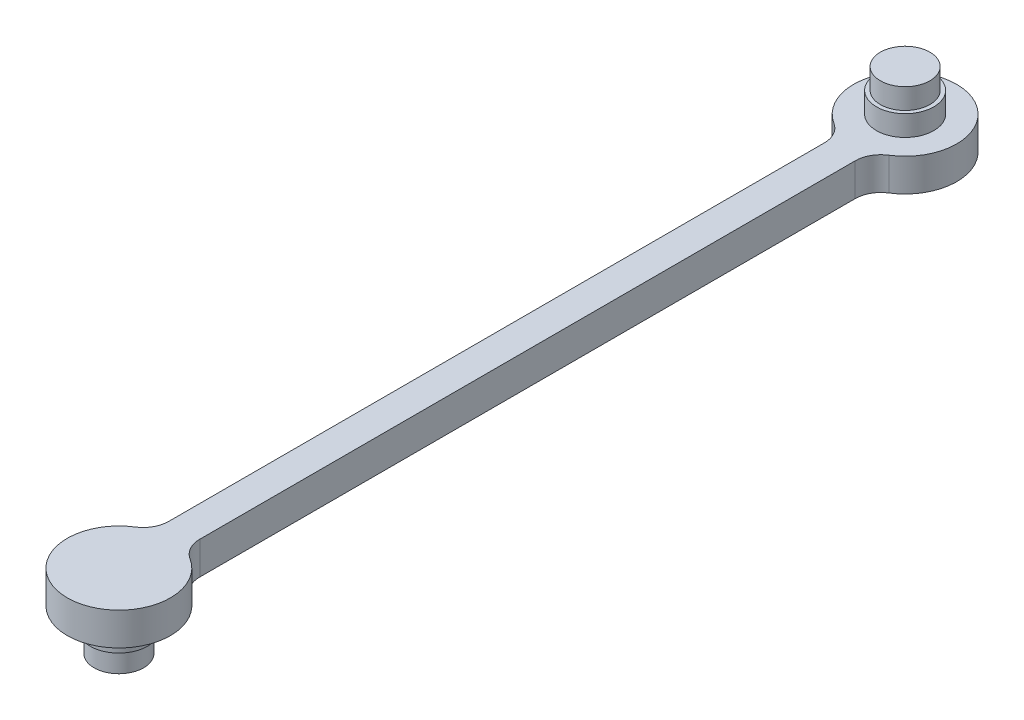
ISO-10303-21;
HEADER;
FILE_DESCRIPTION(('STEP AP214'),'2;1');
FILE_NAME('part.step','',(''),(''),'','','');
FILE_SCHEMA(('AUTOMOTIVE_DESIGN { 1 0 10303 214 1 1 1 1 }'));
ENDSEC;
DATA;
#1=APPLICATION_CONTEXT('core data for automotive mechanical design processes');
#2=APPLICATION_PROTOCOL_DEFINITION('international standard','automotive_design',2000,#1);
#3=PRODUCT_CONTEXT('',#1,'mechanical');
#4=PRODUCT('Part','Part','',(#3));
#5=PRODUCT_RELATED_PRODUCT_CATEGORY('part','',(#4));
#6=PRODUCT_DEFINITION_FORMATION('','',#4);
#7=PRODUCT_DEFINITION_CONTEXT('part definition',#1,'design');
#8=PRODUCT_DEFINITION('design','',#6,#7);
#9=PRODUCT_DEFINITION_SHAPE('','',#8);
#10=(LENGTH_UNIT() NAMED_UNIT(*) SI_UNIT(.MILLI.,.METRE.));
#11=(NAMED_UNIT(*) PLANE_ANGLE_UNIT() SI_UNIT($,.RADIAN.));
#12=(NAMED_UNIT(*) SI_UNIT($,.STERADIAN.) SOLID_ANGLE_UNIT());
#13=UNCERTAINTY_MEASURE_WITH_UNIT(LENGTH_MEASURE(1.E-05),#10,'distance_accuracy_value','');
#14=(GEOMETRIC_REPRESENTATION_CONTEXT(3) GLOBAL_UNCERTAINTY_ASSIGNED_CONTEXT((#13)) GLOBAL_UNIT_ASSIGNED_CONTEXT((#10,
#11,#12)) REPRESENTATION_CONTEXT('',''));
#15=CARTESIAN_POINT('',(0.,0.,0.));
#16=DIRECTION('',(0.,0.,1.));
#17=DIRECTION('',(1.,0.,0.));
#18=AXIS2_PLACEMENT_3D('',#15,#16,#17);
#19=CARTESIAN_POINT('',(3.,6.35,0.));
#20=DIRECTION('',(0.,-1.,0.));
#21=DIRECTION('',(0.,0.,-1.));
#22=AXIS2_PLACEMENT_3D('',#19,#20,#21);
#23=CYLINDRICAL_SURFACE('',#22,10.);
#24=CARTESIAN_POINT('',(3.,6.35,0.));
#25=DIRECTION('',(0.,1.,0.));
#26=DIRECTION('',(0.,0.,1.));
#27=AXIS2_PLACEMENT_3D('',#24,#25,#26);
#28=CIRCLE('',#27,10.);
#29=CARTESIAN_POINT('',(-2.33333333333333,6.35,-8.45905169363301));
#30=VERTEX_POINT('',#29);
#31=CARTESIAN_POINT('',(8.33333333333333,6.35,-8.45905169363301));
#32=VERTEX_POINT('',#31);
#33=EDGE_CURVE('E130',#30,#32,#28,.T.);
#34=ORIENTED_EDGE('',*,*,#33,.F.);
#35=DIRECTION('',(0.,-1.,0.));
#36=VECTOR('',#35,1.);
#37=CARTESIAN_POINT('',(-2.33333333333333,6.35,-8.45905169363301));
#38=LINE('',#37,#36);
#39=CARTESIAN_POINT('',(-2.33333333333333,0.,-8.45905169363301));
#40=VERTEX_POINT('',#39);
#41=EDGE_CURVE('E110',#30,#40,#38,.T.);
#42=ORIENTED_EDGE('',*,*,#41,.T.);
#43=CARTESIAN_POINT('',(3.,0.,0.));
#44=DIRECTION('',(0.,1.,0.));
#45=DIRECTION('',(0.,0.,1.));
#46=AXIS2_PLACEMENT_3D('',#43,#44,#45);
#47=CIRCLE('',#46,10.);
#48=CARTESIAN_POINT('',(8.33333333333333,0.,-8.45905169363301));
#49=VERTEX_POINT('',#48);
#50=EDGE_CURVE('E132',#40,#49,#47,.T.);
#51=ORIENTED_EDGE('',*,*,#50,.T.);
#52=DIRECTION('',(0.,-1.,0.));
#53=VECTOR('',#52,1.);
#54=CARTESIAN_POINT('',(8.33333333333333,6.35,-8.45905169363301));
#55=LINE('',#54,#53);
#56=EDGE_CURVE('E48',#49,#32,#55,.F.);
#57=ORIENTED_EDGE('',*,*,#56,.T.);
#58=EDGE_LOOP('',(#34,#42,#51,#57));
#59=FACE_BOUND('',#58,.T.);
#60=ADVANCED_FACE('F33',(#59),#23,.T.);
#61=CARTESIAN_POINT('',(6.,6.35,0.));
#62=DIRECTION('',(-1.,0.,0.));
#63=DIRECTION('',(0.,0.,1.));
#64=AXIS2_PLACEMENT_3D('',#61,#62,#63);
#65=PLANE('',#64);
#66=DIRECTION('',(0.,0.,-1.));
#67=VECTOR('',#66,1.);
#68=CARTESIAN_POINT('',(6.,0.,0.));
#69=LINE('',#68,#67);
#70=CARTESIAN_POINT('',(6.,0.,-12.6885775404495));
#71=VERTEX_POINT('',#70);
#72=CARTESIAN_POINT('',(5.99999999999997,0.,-139.71142245955));
#73=VERTEX_POINT('',#72);
#74=EDGE_CURVE('E128',#71,#73,#69,.T.);
#75=ORIENTED_EDGE('',*,*,#74,.T.);
#76=DIRECTION('',(0.,1.,0.));
#77=VECTOR('',#76,1.);
#78=CARTESIAN_POINT('',(5.99999999999997,6.35,-139.71142245955));
#79=LINE('',#78,#77);
#80=CARTESIAN_POINT('',(5.99999999999997,6.35,-139.71142245955));
#81=VERTEX_POINT('',#80);
#82=EDGE_CURVE('E104',#73,#81,#79,.T.);
#83=ORIENTED_EDGE('',*,*,#82,.T.);
#84=DIRECTION('',(0.,0.,-1.));
#85=VECTOR('',#84,1.);
#86=CARTESIAN_POINT('',(6.,6.35,0.));
#87=LINE('',#86,#85);
#88=CARTESIAN_POINT('',(6.,6.35,-12.6885775404495));
#89=VERTEX_POINT('',#88);
#90=EDGE_CURVE('E163',#89,#81,#87,.T.);
#91=ORIENTED_EDGE('',*,*,#90,.F.);
#92=DIRECTION('',(0.,1.,0.));
#93=VECTOR('',#92,1.);
#94=CARTESIAN_POINT('',(6.,0.,-12.6885775404495));
#95=LINE('',#94,#93);
#96=EDGE_CURVE('E120',#89,#71,#95,.F.);
#97=ORIENTED_EDGE('',*,*,#96,.T.);
#98=EDGE_LOOP('',(#75,#83,#91,#97));
#99=FACE_BOUND('',#98,.T.);
#100=ADVANCED_FACE('F165',(#99),#65,.F.);
#101=CARTESIAN_POINT('',(2.99999999999997,6.35,-152.4));
#102=DIRECTION('',(0.,-1.,0.));
#103=DIRECTION('',(0.,0.,-1.));
#104=AXIS2_PLACEMENT_3D('',#101,#102,#103);
#105=CYLINDRICAL_SURFACE('',#104,10.);
#106=CARTESIAN_POINT('',(2.99999999999997,6.35,-152.4));
#107=DIRECTION('',(0.,1.,0.));
#108=DIRECTION('',(0.,0.,1.));
#109=AXIS2_PLACEMENT_3D('',#106,#107,#108);
#110=CIRCLE('',#109,10.);
#111=CARTESIAN_POINT('',(8.33333333333332,6.35,-143.940948306367));
#112=VERTEX_POINT('',#111);
#113=CARTESIAN_POINT('',(-2.33333333333334,6.35,-143.940948306367));
#114=VERTEX_POINT('',#113);
#115=EDGE_CURVE('E119',#112,#114,#110,.T.);
#116=ORIENTED_EDGE('',*,*,#115,.F.);
#117=DIRECTION('',(0.,-1.,0.));
#118=VECTOR('',#117,1.);
#119=CARTESIAN_POINT('',(8.33333333333332,6.35,-143.940948306367));
#120=LINE('',#119,#118);
#121=CARTESIAN_POINT('',(8.33333333333332,0.,-143.940948306367));
#122=VERTEX_POINT('',#121);
#123=EDGE_CURVE('E103',#112,#122,#120,.T.);
#124=ORIENTED_EDGE('',*,*,#123,.T.);
#125=CARTESIAN_POINT('',(2.99999999999997,0.,-152.4));
#126=DIRECTION('',(0.,1.,0.));
#127=DIRECTION('',(0.,0.,1.));
#128=AXIS2_PLACEMENT_3D('',#125,#126,#127);
#129=CIRCLE('',#128,10.);
#130=CARTESIAN_POINT('',(-2.33333333333334,0.,-143.940948306367));
#131=VERTEX_POINT('',#130);
#132=EDGE_CURVE('E116',#122,#131,#129,.T.);
#133=ORIENTED_EDGE('',*,*,#132,.T.);
#134=DIRECTION('',(0.,-1.,0.));
#135=VECTOR('',#134,1.);
#136=CARTESIAN_POINT('',(-2.33333333333335,6.35,-143.940948306367));
#137=LINE('',#136,#135);
#138=EDGE_CURVE('E121',#131,#114,#137,.F.);
#139=ORIENTED_EDGE('',*,*,#138,.T.);
#140=EDGE_LOOP('',(#116,#124,#133,#139));
#141=FACE_BOUND('',#140,.T.);
#142=ADVANCED_FACE('F115',(#141),#105,.T.);
#143=CARTESIAN_POINT('',(0.,6.35,0.));
#144=DIRECTION('',(-1.,0.,0.));
#145=DIRECTION('',(0.,0.,1.));
#146=AXIS2_PLACEMENT_3D('',#143,#144,#145);
#147=PLANE('',#146);
#148=DIRECTION('',(0.,0.,-1.));
#149=VECTOR('',#148,1.);
#150=CARTESIAN_POINT('',(0.,6.35,0.));
#151=LINE('',#150,#149);
#152=CARTESIAN_POINT('',(0.,6.35,-12.6885775404495));
#153=VERTEX_POINT('',#152);
#154=CARTESIAN_POINT('',(0.,6.35,-139.71142245955));
#155=VERTEX_POINT('',#154);
#156=EDGE_CURVE('E167',#153,#155,#151,.T.);
#157=ORIENTED_EDGE('',*,*,#156,.T.);
#158=DIRECTION('',(0.,-1.,0.));
#159=VECTOR('',#158,1.);
#160=CARTESIAN_POINT('',(0.,6.35,-139.71142245955));
#161=LINE('',#160,#159);
#162=CARTESIAN_POINT('',(0.,0.,-139.71142245955));
#163=VERTEX_POINT('',#162);
#164=EDGE_CURVE('E143',#155,#163,#161,.T.);
#165=ORIENTED_EDGE('',*,*,#164,.T.);
#166=DIRECTION('',(0.,0.,-1.));
#167=VECTOR('',#166,1.);
#168=CARTESIAN_POINT('',(0.,0.,0.));
#169=LINE('',#168,#167);
#170=CARTESIAN_POINT('',(0.,0.,-12.6885775404495));
#171=VERTEX_POINT('',#170);
#172=EDGE_CURVE('E127',#171,#163,#169,.T.);
#173=ORIENTED_EDGE('',*,*,#172,.F.);
#174=DIRECTION('',(0.,-1.,0.));
#175=VECTOR('',#174,1.);
#176=CARTESIAN_POINT('',(0.,6.35,-12.6885775404495));
#177=LINE('',#176,#175);
#178=EDGE_CURVE('E141',#171,#153,#177,.F.);
#179=ORIENTED_EDGE('',*,*,#178,.T.);
#180=EDGE_LOOP('',(#157,#165,#173,#179));
#181=FACE_BOUND('',#180,.T.);
#182=ADVANCED_FACE('F243',(#181),#147,.T.);
#183=CARTESIAN_POINT('',(0.,6.35,0.));
#184=DIRECTION('',(0.,1.,0.));
#185=DIRECTION('',(0.,0.,1.));
#186=AXIS2_PLACEMENT_3D('',#183,#184,#185);
#187=PLANE('',#186);
#188=CARTESIAN_POINT('',(3.,6.35,-152.4));
#189=DIRECTION('',(0.,1.,0.));
#190=DIRECTION('',(0.,0.,1.));
#191=AXIS2_PLACEMENT_3D('',#188,#189,#190);
#192=CIRCLE('',#191,5.55625);
#193=CARTESIAN_POINT('',(3.,6.35,-146.84375));
#194=VERTEX_POINT('',#193);
#195=EDGE_CURVE('E187',#194,#194,#192,.T.);
#196=ORIENTED_EDGE('',*,*,#195,.F.);
#197=EDGE_LOOP('',(#196));
#198=FACE_BOUND('',#197,.T.);
#199=ORIENTED_EDGE('',*,*,#156,.F.);
#200=CARTESIAN_POINT('',(-5.,6.35,-12.6885775404495));
#201=DIRECTION('',(0.,1.,0.));
#202=DIRECTION('',(0.,0.,1.));
#203=AXIS2_PLACEMENT_3D('',#200,#201,#202);
#204=CIRCLE('',#203,5.);
#205=EDGE_CURVE('E55',#153,#30,#204,.F.);
#206=ORIENTED_EDGE('',*,*,#205,.T.);
#207=ORIENTED_EDGE('',*,*,#33,.T.);
#208=CARTESIAN_POINT('',(11.,6.35,-12.6885775404495));
#209=DIRECTION('',(0.,1.,0.));
#210=DIRECTION('',(0.,0.,1.));
#211=AXIS2_PLACEMENT_3D('',#208,#209,#210);
#212=CIRCLE('',#211,5.);
#213=EDGE_CURVE('E11',#32,#89,#212,.F.);
#214=ORIENTED_EDGE('',*,*,#213,.T.);
#215=ORIENTED_EDGE('',*,*,#90,.T.);
#216=CARTESIAN_POINT('',(11.,6.35,-139.71142245955));
#217=DIRECTION('',(0.,1.,0.));
#218=DIRECTION('',(0.,0.,1.));
#219=AXIS2_PLACEMENT_3D('',#216,#217,#218);
#220=CIRCLE('',#219,5.);
#221=EDGE_CURVE('E109',#81,#112,#220,.F.);
#222=ORIENTED_EDGE('',*,*,#221,.T.);
#223=ORIENTED_EDGE('',*,*,#115,.T.);
#224=CARTESIAN_POINT('',(-5.,6.35,-139.71142245955));
#225=DIRECTION('',(0.,1.,0.));
#226=DIRECTION('',(0.,0.,1.));
#227=AXIS2_PLACEMENT_3D('',#224,#225,#226);
#228=CIRCLE('',#227,5.);
#229=EDGE_CURVE('E151',#114,#155,#228,.F.);
#230=ORIENTED_EDGE('',*,*,#229,.T.);
#231=EDGE_LOOP('',(#199,#206,#207,#214,#215,#222,#223,#230));
#232=FACE_BOUND('',#231,.T.);
#233=ADVANCED_FACE('F162',(#198,#232),#187,.T.);
#234=CARTESIAN_POINT('',(0.,0.,0.));
#235=DIRECTION('',(0.,1.,0.));
#236=DIRECTION('',(0.,0.,1.));
#237=AXIS2_PLACEMENT_3D('',#234,#235,#236);
#238=PLANE('',#237);
#239=CARTESIAN_POINT('',(3.,0.,0.));
#240=DIRECTION('',(0.,-1.,0.));
#241=DIRECTION('',(0.,0.,-1.));
#242=AXIS2_PLACEMENT_3D('',#239,#240,#241);
#243=CIRCLE('',#242,5.55625);
#244=CARTESIAN_POINT('',(3.,0.,-5.55625));
#245=VERTEX_POINT('',#244);
#246=EDGE_CURVE('E177',#245,#245,#243,.T.);
#247=ORIENTED_EDGE('',*,*,#246,.F.);
#248=EDGE_LOOP('',(#247));
#249=FACE_BOUND('',#248,.T.);
#250=ORIENTED_EDGE('',*,*,#50,.F.);
#251=CARTESIAN_POINT('',(-5.,0.,-12.6885775404495));
#252=DIRECTION('',(0.,1.,0.));
#253=DIRECTION('',(0.,0.,1.));
#254=AXIS2_PLACEMENT_3D('',#251,#252,#253);
#255=CIRCLE('',#254,5.);
#256=EDGE_CURVE('E153',#40,#171,#255,.T.);
#257=ORIENTED_EDGE('',*,*,#256,.T.);
#258=ORIENTED_EDGE('',*,*,#172,.T.);
#259=CARTESIAN_POINT('',(-5.,0.,-139.71142245955));
#260=DIRECTION('',(0.,1.,0.));
#261=DIRECTION('',(0.,0.,1.));
#262=AXIS2_PLACEMENT_3D('',#259,#260,#261);
#263=CIRCLE('',#262,5.);
#264=EDGE_CURVE('E126',#163,#131,#263,.T.);
#265=ORIENTED_EDGE('',*,*,#264,.T.);
#266=ORIENTED_EDGE('',*,*,#132,.F.);
#267=CARTESIAN_POINT('',(11.,0.,-139.71142245955));
#268=DIRECTION('',(0.,1.,0.));
#269=DIRECTION('',(0.,0.,1.));
#270=AXIS2_PLACEMENT_3D('',#267,#268,#269);
#271=CIRCLE('',#270,5.);
#272=EDGE_CURVE('E99',#122,#73,#271,.T.);
#273=ORIENTED_EDGE('',*,*,#272,.T.);
#274=ORIENTED_EDGE('',*,*,#74,.F.);
#275=CARTESIAN_POINT('',(11.,0.,-12.6885775404495));
#276=DIRECTION('',(0.,1.,0.));
#277=DIRECTION('',(0.,0.,1.));
#278=AXIS2_PLACEMENT_3D('',#275,#276,#277);
#279=CIRCLE('',#278,5.);
#280=EDGE_CURVE('E41',#71,#49,#279,.T.);
#281=ORIENTED_EDGE('',*,*,#280,.T.);
#282=EDGE_LOOP('',(#250,#257,#258,#265,#266,#273,#274,#281));
#283=FACE_BOUND('',#282,.T.);
#284=ADVANCED_FACE('F124',(#249,#283),#238,.F.);
#285=CARTESIAN_POINT('',(3.,10.35,-152.4));
#286=DIRECTION('',(0.,-1.,0.));
#287=DIRECTION('',(0.,0.,-1.));
#288=AXIS2_PLACEMENT_3D('',#285,#286,#287);
#289=CYLINDRICAL_SURFACE('',#288,5.55625);
#290=CARTESIAN_POINT('',(3.,10.35,-152.4));
#291=DIRECTION('',(0.,1.,0.));
#292=DIRECTION('',(0.,0.,1.));
#293=AXIS2_PLACEMENT_3D('',#290,#291,#292);
#294=CIRCLE('',#293,5.55625);
#295=CARTESIAN_POINT('',(3.,10.35,-146.84375));
#296=VERTEX_POINT('',#295);
#297=EDGE_CURVE('E158',#296,#296,#294,.T.);
#298=ORIENTED_EDGE('',*,*,#297,.F.);
#299=EDGE_LOOP('',(#298));
#300=FACE_BOUND('',#299,.T.);
#301=ORIENTED_EDGE('',*,*,#195,.T.);
#302=EDGE_LOOP('',(#301));
#303=FACE_BOUND('',#302,.T.);
#304=ADVANCED_FACE('F255',(#300,#303),#289,.T.);
#305=CARTESIAN_POINT('',(3.,10.35,-152.4));
#306=DIRECTION('',(0.,1.,0.));
#307=DIRECTION('',(0.,0.,1.));
#308=AXIS2_PLACEMENT_3D('',#305,#306,#307);
#309=PLANE('',#308);
#310=CARTESIAN_POINT('',(3.,10.35,-152.4));
#311=DIRECTION('',(0.,1.,0.));
#312=DIRECTION('',(0.,0.,1.));
#313=AXIS2_PLACEMENT_3D('',#310,#311,#312);
#314=CIRCLE('',#313,4.805);
#315=CARTESIAN_POINT('',(3.,10.35,-147.595));
#316=VERTEX_POINT('',#315);
#317=EDGE_CURVE('E173',#316,#316,#314,.T.);
#318=ORIENTED_EDGE('',*,*,#317,.F.);
#319=EDGE_LOOP('',(#318));
#320=FACE_BOUND('',#319,.T.);
#321=ORIENTED_EDGE('',*,*,#297,.T.);
#322=EDGE_LOOP('',(#321));
#323=FACE_BOUND('',#322,.T.);
#324=ADVANCED_FACE('F260',(#320,#323),#309,.T.);
#325=CARTESIAN_POINT('',(3.,14.35,-152.4));
#326=DIRECTION('',(0.,-1.,0.));
#327=DIRECTION('',(0.,0.,-1.));
#328=AXIS2_PLACEMENT_3D('',#325,#326,#327);
#329=CYLINDRICAL_SURFACE('',#328,4.805);
#330=CARTESIAN_POINT('',(3.,14.35,-152.4));
#331=DIRECTION('',(0.,1.,0.));
#332=DIRECTION('',(0.,0.,1.));
#333=AXIS2_PLACEMENT_3D('',#330,#331,#332);
#334=CIRCLE('',#333,4.805);
#335=CARTESIAN_POINT('',(3.,14.35,-147.595));
#336=VERTEX_POINT('',#335);
#337=EDGE_CURVE('E185',#336,#336,#334,.T.);
#338=ORIENTED_EDGE('',*,*,#337,.F.);
#339=EDGE_LOOP('',(#338));
#340=FACE_BOUND('',#339,.T.);
#341=ORIENTED_EDGE('',*,*,#317,.T.);
#342=EDGE_LOOP('',(#341));
#343=FACE_BOUND('',#342,.T.);
#344=ADVANCED_FACE('F264',(#340,#343),#329,.T.);
#345=CARTESIAN_POINT('',(3.,14.35,-152.4));
#346=DIRECTION('',(0.,1.,0.));
#347=DIRECTION('',(0.,0.,1.));
#348=AXIS2_PLACEMENT_3D('',#345,#346,#347);
#349=PLANE('',#348);
#350=ORIENTED_EDGE('',*,*,#337,.T.);
#351=EDGE_LOOP('',(#350));
#352=FACE_BOUND('',#351,.T.);
#353=ADVANCED_FACE('F219',(#352),#349,.T.);
#354=CARTESIAN_POINT('',(3.,-4.,0.));
#355=DIRECTION('',(0.,1.,0.));
#356=DIRECTION('',(0.,0.,1.));
#357=AXIS2_PLACEMENT_3D('',#354,#355,#356);
#358=CYLINDRICAL_SURFACE('',#357,5.55625);
#359=CARTESIAN_POINT('',(3.,-4.,0.));
#360=DIRECTION('',(0.,-1.,0.));
#361=DIRECTION('',(0.,0.,-1.));
#362=AXIS2_PLACEMENT_3D('',#359,#360,#361);
#363=CIRCLE('',#362,5.55625);
#364=CARTESIAN_POINT('',(3.,-4.,-5.55625));
#365=VERTEX_POINT('',#364);
#366=EDGE_CURVE('E192',#365,#365,#363,.T.);
#367=ORIENTED_EDGE('',*,*,#366,.F.);
#368=EDGE_LOOP('',(#367));
#369=FACE_BOUND('',#368,.T.);
#370=ORIENTED_EDGE('',*,*,#246,.T.);
#371=EDGE_LOOP('',(#370));
#372=FACE_BOUND('',#371,.T.);
#373=ADVANCED_FACE('F210',(#369,#372),#358,.T.);
#374=CARTESIAN_POINT('',(3.,-4.,0.));
#375=DIRECTION('',(0.,-1.,0.));
#376=DIRECTION('',(0.,0.,-1.));
#377=AXIS2_PLACEMENT_3D('',#374,#375,#376);
#378=PLANE('',#377);
#379=CARTESIAN_POINT('',(3.,-4.,0.));
#380=DIRECTION('',(0.,-1.,0.));
#381=DIRECTION('',(0.,0.,-1.));
#382=AXIS2_PLACEMENT_3D('',#379,#380,#381);
#383=CIRCLE('',#382,4.805);
#384=CARTESIAN_POINT('',(3.,-4.,-4.805));
#385=VERTEX_POINT('',#384);
#386=EDGE_CURVE('E136',#385,#385,#383,.T.);
#387=ORIENTED_EDGE('',*,*,#386,.F.);
#388=EDGE_LOOP('',(#387));
#389=FACE_BOUND('',#388,.T.);
#390=ORIENTED_EDGE('',*,*,#366,.T.);
#391=EDGE_LOOP('',(#390));
#392=FACE_BOUND('',#391,.T.);
#393=ADVANCED_FACE('F208',(#389,#392),#378,.T.);
#394=CARTESIAN_POINT('',(3.,-8.,0.));
#395=DIRECTION('',(0.,1.,0.));
#396=DIRECTION('',(0.,0.,1.));
#397=AXIS2_PLACEMENT_3D('',#394,#395,#396);
#398=CYLINDRICAL_SURFACE('',#397,4.805);
#399=CARTESIAN_POINT('',(3.,-8.,0.));
#400=DIRECTION('',(0.,-1.,0.));
#401=DIRECTION('',(0.,0.,-1.));
#402=AXIS2_PLACEMENT_3D('',#399,#400,#401);
#403=CIRCLE('',#402,4.805);
#404=CARTESIAN_POINT('',(3.,-8.,-4.805));
#405=VERTEX_POINT('',#404);
#406=EDGE_CURVE('E196',#405,#405,#403,.T.);
#407=ORIENTED_EDGE('',*,*,#406,.F.);
#408=EDGE_LOOP('',(#407));
#409=FACE_BOUND('',#408,.T.);
#410=ORIENTED_EDGE('',*,*,#386,.T.);
#411=EDGE_LOOP('',(#410));
#412=FACE_BOUND('',#411,.T.);
#413=ADVANCED_FACE('F206',(#409,#412),#398,.T.);
#414=CARTESIAN_POINT('',(3.,-8.,0.));
#415=DIRECTION('',(0.,-1.,0.));
#416=DIRECTION('',(0.,0.,-1.));
#417=AXIS2_PLACEMENT_3D('',#414,#415,#416);
#418=PLANE('',#417);
#419=ORIENTED_EDGE('',*,*,#406,.T.);
#420=EDGE_LOOP('',(#419));
#421=FACE_BOUND('',#420,.T.);
#422=ADVANCED_FACE('F216',(#421),#418,.T.);
#423=CARTESIAN_POINT('',(11.,6.35,-139.71142245955));
#424=DIRECTION('',(0.,-1.,0.));
#425=DIRECTION('',(0.,0.,-1.));
#426=AXIS2_PLACEMENT_3D('',#423,#424,#425);
#427=CYLINDRICAL_SURFACE('',#426,5.);
#428=ORIENTED_EDGE('',*,*,#221,.F.);
#429=ORIENTED_EDGE('',*,*,#82,.F.);
#430=ORIENTED_EDGE('',*,*,#272,.F.);
#431=ORIENTED_EDGE('',*,*,#123,.F.);
#432=EDGE_LOOP('',(#428,#429,#430,#431));
#433=FACE_BOUND('',#432,.T.);
#434=ADVANCED_FACE('F102',(#433),#427,.F.);
#435=CARTESIAN_POINT('',(-5.,6.35,-139.71142245955));
#436=DIRECTION('',(0.,-1.,0.));
#437=DIRECTION('',(0.,0.,-1.));
#438=AXIS2_PLACEMENT_3D('',#435,#436,#437);
#439=CYLINDRICAL_SURFACE('',#438,5.);
#440=ORIENTED_EDGE('',*,*,#229,.F.);
#441=ORIENTED_EDGE('',*,*,#138,.F.);
#442=ORIENTED_EDGE('',*,*,#264,.F.);
#443=ORIENTED_EDGE('',*,*,#164,.F.);
#444=EDGE_LOOP('',(#440,#441,#442,#443));
#445=FACE_BOUND('',#444,.T.);
#446=ADVANCED_FACE('F232',(#445),#439,.F.);
#447=CARTESIAN_POINT('',(-5.,6.35,-12.6885775404495));
#448=DIRECTION('',(0.,-1.,0.));
#449=DIRECTION('',(0.,0.,-1.));
#450=AXIS2_PLACEMENT_3D('',#447,#448,#449);
#451=CYLINDRICAL_SURFACE('',#450,5.);
#452=ORIENTED_EDGE('',*,*,#205,.F.);
#453=ORIENTED_EDGE('',*,*,#178,.F.);
#454=ORIENTED_EDGE('',*,*,#256,.F.);
#455=ORIENTED_EDGE('',*,*,#41,.F.);
#456=EDGE_LOOP('',(#452,#453,#454,#455));
#457=FACE_BOUND('',#456,.T.);
#458=ADVANCED_FACE('F234',(#457),#451,.F.);
#459=CARTESIAN_POINT('',(11.,6.35,-12.6885775404495));
#460=DIRECTION('',(0.,-1.,0.));
#461=DIRECTION('',(0.,0.,-1.));
#462=AXIS2_PLACEMENT_3D('',#459,#460,#461);
#463=CYLINDRICAL_SURFACE('',#462,5.);
#464=ORIENTED_EDGE('',*,*,#213,.F.);
#465=ORIENTED_EDGE('',*,*,#56,.F.);
#466=ORIENTED_EDGE('',*,*,#280,.F.);
#467=ORIENTED_EDGE('',*,*,#96,.F.);
#468=EDGE_LOOP('',(#464,#465,#466,#467));
#469=FACE_BOUND('',#468,.T.);
#470=ADVANCED_FACE('F35',(#469),#463,.F.);
#471=CLOSED_SHELL('',(#60,#100,#142,#182,#233,#284,#304,#324,#344,#353,#373,#393,#413,#422,#434,
#446,#458,#470));
#472=MANIFOLD_SOLID_BREP('B2',#471);
#473=ADVANCED_BREP_SHAPE_REPRESENTATION('',(#18,#472),#14);
#474=SHAPE_DEFINITION_REPRESENTATION(#9,#473);
ENDSEC;
END-ISO-10303-21;
